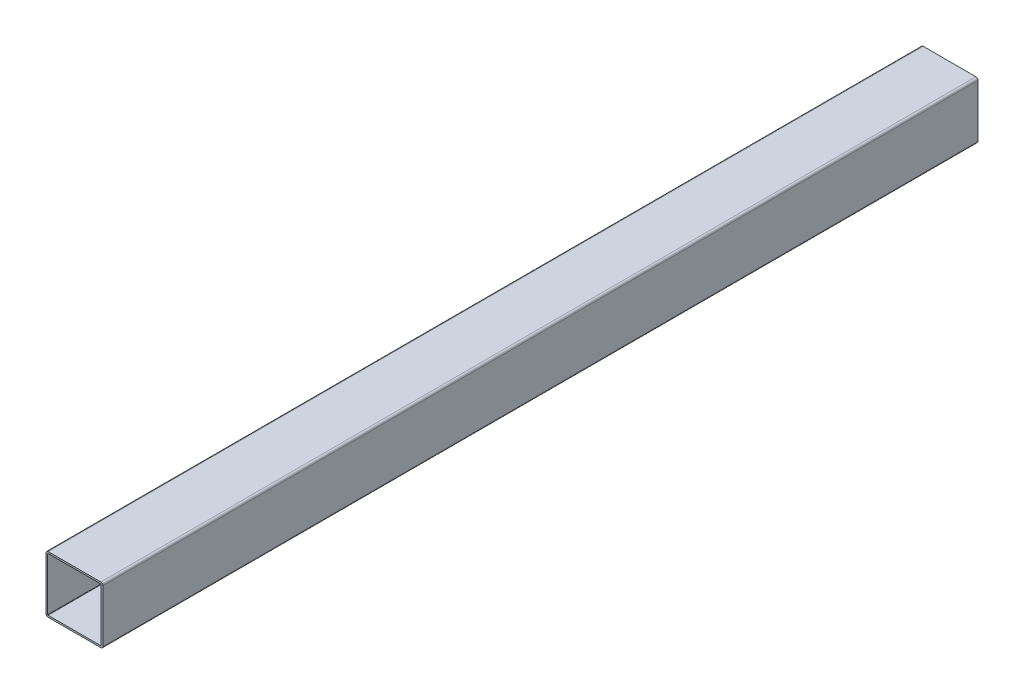
ISO-10303-21;
HEADER;
FILE_DESCRIPTION(('STEP AP214'),'2;1');
FILE_NAME('part.step','',(''),(''),'','','');
FILE_SCHEMA(('AUTOMOTIVE_DESIGN { 1 0 10303 214 1 1 1 1 }'));
ENDSEC;
DATA;
#1=APPLICATION_CONTEXT('core data for automotive mechanical design processes');
#2=APPLICATION_PROTOCOL_DEFINITION('international standard','automotive_design',2000,#1);
#3=PRODUCT_CONTEXT('',#1,'mechanical');
#4=PRODUCT('Part','Part','',(#3));
#5=PRODUCT_RELATED_PRODUCT_CATEGORY('part','',(#4));
#6=PRODUCT_DEFINITION_FORMATION('','',#4);
#7=PRODUCT_DEFINITION_CONTEXT('part definition',#1,'design');
#8=PRODUCT_DEFINITION('design','',#6,#7);
#9=PRODUCT_DEFINITION_SHAPE('','',#8);
#10=(LENGTH_UNIT() NAMED_UNIT(*) SI_UNIT(.MILLI.,.METRE.));
#11=(NAMED_UNIT(*) PLANE_ANGLE_UNIT() SI_UNIT($,.RADIAN.));
#12=(NAMED_UNIT(*) SI_UNIT($,.STERADIAN.) SOLID_ANGLE_UNIT());
#13=UNCERTAINTY_MEASURE_WITH_UNIT(LENGTH_MEASURE(1.E-05),#10,'distance_accuracy_value','');
#14=(GEOMETRIC_REPRESENTATION_CONTEXT(3) GLOBAL_UNCERTAINTY_ASSIGNED_CONTEXT((#13)) GLOBAL_UNIT_ASSIGNED_CONTEXT((#10,
#11,#12)) REPRESENTATION_CONTEXT('',''));
#15=CARTESIAN_POINT('',(0.,0.,0.));
#16=DIRECTION('',(0.,0.,1.));
#17=DIRECTION('',(1.,0.,0.));
#18=AXIS2_PLACEMENT_3D('',#15,#16,#17);
#19=CARTESIAN_POINT('',(-18.5,18.5,-615.));
#20=DIRECTION('',(0.,0.,1.));
#21=DIRECTION('',(1.,0.,0.));
#22=AXIS2_PLACEMENT_3D('',#19,#20,#21);
#23=CYLINDRICAL_SURFACE('',#22,1.5);
#24=CARTESIAN_POINT('',(-18.5,18.5,0.));
#25=DIRECTION('',(0.,0.,-1.));
#26=DIRECTION('',(-1.,0.,0.));
#27=AXIS2_PLACEMENT_3D('',#24,#25,#26);
#28=CIRCLE('',#27,1.5);
#29=CARTESIAN_POINT('',(-20.,18.5,0.));
#30=VERTEX_POINT('',#29);
#31=CARTESIAN_POINT('',(-18.5,20.,0.));
#32=VERTEX_POINT('',#31);
#33=EDGE_CURVE('E235',#30,#32,#28,.T.);
#34=ORIENTED_EDGE('',*,*,#33,.T.);
#35=DIRECTION('',(0.,0.,1.));
#36=VECTOR('',#35,1.);
#37=CARTESIAN_POINT('',(-18.5,20.,-615.));
#38=LINE('',#37,#36);
#39=CARTESIAN_POINT('',(-18.5,20.,-615.));
#40=VERTEX_POINT('',#39);
#41=EDGE_CURVE('E12',#40,#32,#38,.T.);
#42=ORIENTED_EDGE('',*,*,#41,.F.);
#43=CARTESIAN_POINT('',(-18.5,18.5,-615.));
#44=DIRECTION('',(0.,0.,-1.));
#45=DIRECTION('',(-1.,0.,0.));
#46=AXIS2_PLACEMENT_3D('',#43,#44,#45);
#47=CIRCLE('',#46,1.5);
#48=CARTESIAN_POINT('',(-20.,18.5,-615.));
#49=VERTEX_POINT('',#48);
#50=EDGE_CURVE('E313',#49,#40,#47,.T.);
#51=ORIENTED_EDGE('',*,*,#50,.F.);
#52=DIRECTION('',(0.,0.,1.));
#53=VECTOR('',#52,1.);
#54=CARTESIAN_POINT('',(-20.,18.5,-615.));
#55=LINE('',#54,#53);
#56=EDGE_CURVE('E250',#49,#30,#55,.T.);
#57=ORIENTED_EDGE('',*,*,#56,.T.);
#58=EDGE_LOOP('',(#34,#42,#51,#57));
#59=FACE_BOUND('',#58,.T.);
#60=ADVANCED_FACE('F63',(#59),#23,.T.);
#61=CARTESIAN_POINT('',(-18.5,20.,-615.));
#62=DIRECTION('',(0.,-1.,0.));
#63=DIRECTION('',(0.,0.,-1.));
#64=AXIS2_PLACEMENT_3D('',#61,#62,#63);
#65=PLANE('',#64);
#66=DIRECTION('',(1.,0.,0.));
#67=VECTOR('',#66,1.);
#68=CARTESIAN_POINT('',(-18.5,20.,0.));
#69=LINE('',#68,#67);
#70=CARTESIAN_POINT('',(18.5,20.,0.));
#71=VERTEX_POINT('',#70);
#72=EDGE_CURVE('E238',#32,#71,#69,.T.);
#73=ORIENTED_EDGE('',*,*,#72,.T.);
#74=DIRECTION('',(0.,0.,1.));
#75=VECTOR('',#74,1.);
#76=CARTESIAN_POINT('',(18.5,20.,-615.));
#77=LINE('',#76,#75);
#78=CARTESIAN_POINT('',(18.5,20.,-615.));
#79=VERTEX_POINT('',#78);
#80=EDGE_CURVE('E73',#79,#71,#77,.T.);
#81=ORIENTED_EDGE('',*,*,#80,.F.);
#82=DIRECTION('',(1.,0.,0.));
#83=VECTOR('',#82,1.);
#84=CARTESIAN_POINT('',(-18.5,20.,-615.));
#85=LINE('',#84,#83);
#86=EDGE_CURVE('E315',#40,#79,#85,.T.);
#87=ORIENTED_EDGE('',*,*,#86,.F.);
#88=ORIENTED_EDGE('',*,*,#41,.T.);
#89=EDGE_LOOP('',(#73,#81,#87,#88));
#90=FACE_BOUND('',#89,.T.);
#91=ADVANCED_FACE('F350',(#90),#65,.F.);
#92=CARTESIAN_POINT('',(18.5,18.5,-615.));
#93=DIRECTION('',(0.,0.,1.));
#94=DIRECTION('',(1.,0.,0.));
#95=AXIS2_PLACEMENT_3D('',#92,#93,#94);
#96=CYLINDRICAL_SURFACE('',#95,1.5);
#97=CARTESIAN_POINT('',(18.5,18.5,0.));
#98=DIRECTION('',(0.,0.,-1.));
#99=DIRECTION('',(-1.,0.,0.));
#100=AXIS2_PLACEMENT_3D('',#97,#98,#99);
#101=CIRCLE('',#100,1.5);
#102=CARTESIAN_POINT('',(20.,18.5,0.));
#103=VERTEX_POINT('',#102);
#104=EDGE_CURVE('E240',#71,#103,#101,.T.);
#105=ORIENTED_EDGE('',*,*,#104,.T.);
#106=DIRECTION('',(0.,0.,1.));
#107=VECTOR('',#106,1.);
#108=CARTESIAN_POINT('',(20.,18.5,-615.));
#109=LINE('',#108,#107);
#110=CARTESIAN_POINT('',(20.,18.5,-615.));
#111=VERTEX_POINT('',#110);
#112=EDGE_CURVE('E257',#111,#103,#109,.T.);
#113=ORIENTED_EDGE('',*,*,#112,.F.);
#114=CARTESIAN_POINT('',(18.5,18.5,-615.));
#115=DIRECTION('',(0.,0.,-1.));
#116=DIRECTION('',(-1.,0.,0.));
#117=AXIS2_PLACEMENT_3D('',#114,#115,#116);
#118=CIRCLE('',#117,1.5);
#119=EDGE_CURVE('E317',#79,#111,#118,.T.);
#120=ORIENTED_EDGE('',*,*,#119,.F.);
#121=ORIENTED_EDGE('',*,*,#80,.T.);
#122=EDGE_LOOP('',(#105,#113,#120,#121));
#123=FACE_BOUND('',#122,.T.);
#124=ADVANCED_FACE('F355',(#123),#96,.T.);
#125=CARTESIAN_POINT('',(20.,-18.5,-615.));
#126=DIRECTION('',(-1.,0.,0.));
#127=DIRECTION('',(0.,0.,1.));
#128=AXIS2_PLACEMENT_3D('',#125,#126,#127);
#129=PLANE('',#128);
#130=DIRECTION('',(0.,-1.,0.));
#131=VECTOR('',#130,1.);
#132=CARTESIAN_POINT('',(20.,-18.5,0.));
#133=LINE('',#132,#131);
#134=CARTESIAN_POINT('',(20.,-18.5,0.));
#135=VERTEX_POINT('',#134);
#136=EDGE_CURVE('E242',#103,#135,#133,.T.);
#137=ORIENTED_EDGE('',*,*,#136,.T.);
#138=DIRECTION('',(0.,0.,1.));
#139=VECTOR('',#138,1.);
#140=CARTESIAN_POINT('',(20.,-18.5,-615.));
#141=LINE('',#140,#139);
#142=CARTESIAN_POINT('',(20.,-18.5,-615.));
#143=VERTEX_POINT('',#142);
#144=EDGE_CURVE('E254',#143,#135,#141,.T.);
#145=ORIENTED_EDGE('',*,*,#144,.F.);
#146=DIRECTION('',(0.,-1.,0.));
#147=VECTOR('',#146,1.);
#148=CARTESIAN_POINT('',(20.,-18.5,-615.));
#149=LINE('',#148,#147);
#150=EDGE_CURVE('E319',#111,#143,#149,.T.);
#151=ORIENTED_EDGE('',*,*,#150,.F.);
#152=ORIENTED_EDGE('',*,*,#112,.T.);
#153=EDGE_LOOP('',(#137,#145,#151,#152));
#154=FACE_BOUND('',#153,.T.);
#155=ADVANCED_FACE('F325',(#154),#129,.F.);
#156=CARTESIAN_POINT('',(18.5,-18.5,-615.));
#157=DIRECTION('',(0.,0.,1.));
#158=DIRECTION('',(1.,0.,0.));
#159=AXIS2_PLACEMENT_3D('',#156,#157,#158);
#160=CYLINDRICAL_SURFACE('',#159,1.5);
#161=CARTESIAN_POINT('',(18.5,-18.5,0.));
#162=DIRECTION('',(0.,0.,-1.));
#163=DIRECTION('',(-1.,0.,0.));
#164=AXIS2_PLACEMENT_3D('',#161,#162,#163);
#165=CIRCLE('',#164,1.5);
#166=CARTESIAN_POINT('',(18.5,-20.,0.));
#167=VERTEX_POINT('',#166);
#168=EDGE_CURVE('E244',#135,#167,#165,.T.);
#169=ORIENTED_EDGE('',*,*,#168,.T.);
#170=DIRECTION('',(0.,0.,1.));
#171=VECTOR('',#170,1.);
#172=CARTESIAN_POINT('',(18.5,-20.,-615.));
#173=LINE('',#172,#171);
#174=CARTESIAN_POINT('',(18.5,-20.,-615.));
#175=VERTEX_POINT('',#174);
#176=EDGE_CURVE('E202',#175,#167,#173,.T.);
#177=ORIENTED_EDGE('',*,*,#176,.F.);
#178=CARTESIAN_POINT('',(18.5,-18.5,-615.));
#179=DIRECTION('',(0.,0.,-1.));
#180=DIRECTION('',(-1.,0.,0.));
#181=AXIS2_PLACEMENT_3D('',#178,#179,#180);
#182=CIRCLE('',#181,1.5);
#183=EDGE_CURVE('E193',#143,#175,#182,.T.);
#184=ORIENTED_EDGE('',*,*,#183,.F.);
#185=ORIENTED_EDGE('',*,*,#144,.T.);
#186=EDGE_LOOP('',(#169,#177,#184,#185));
#187=FACE_BOUND('',#186,.T.);
#188=ADVANCED_FACE('F329',(#187),#160,.T.);
#189=CARTESIAN_POINT('',(18.5,-20.,-615.));
#190=DIRECTION('',(0.,1.,0.));
#191=DIRECTION('',(0.,0.,1.));
#192=AXIS2_PLACEMENT_3D('',#189,#190,#191);
#193=PLANE('',#192);
#194=DIRECTION('',(-1.,0.,0.));
#195=VECTOR('',#194,1.);
#196=CARTESIAN_POINT('',(18.5,-20.,0.));
#197=LINE('',#196,#195);
#198=CARTESIAN_POINT('',(-18.5,-20.,0.));
#199=VERTEX_POINT('',#198);
#200=EDGE_CURVE('E201',#167,#199,#197,.T.);
#201=ORIENTED_EDGE('',*,*,#200,.T.);
#202=DIRECTION('',(0.,0.,1.));
#203=VECTOR('',#202,1.);
#204=CARTESIAN_POINT('',(-18.5,-20.,-615.));
#205=LINE('',#204,#203);
#206=CARTESIAN_POINT('',(-18.5,-20.,-615.));
#207=VERTEX_POINT('',#206);
#208=EDGE_CURVE('E198',#207,#199,#205,.T.);
#209=ORIENTED_EDGE('',*,*,#208,.F.);
#210=DIRECTION('',(-1.,0.,0.));
#211=VECTOR('',#210,1.);
#212=CARTESIAN_POINT('',(18.5,-20.,-615.));
#213=LINE('',#212,#211);
#214=EDGE_CURVE('E187',#175,#207,#213,.T.);
#215=ORIENTED_EDGE('',*,*,#214,.F.);
#216=ORIENTED_EDGE('',*,*,#176,.T.);
#217=EDGE_LOOP('',(#201,#209,#215,#216));
#218=FACE_BOUND('',#217,.T.);
#219=ADVANCED_FACE('F199',(#218),#193,.F.);
#220=CARTESIAN_POINT('',(-18.5,-18.5,-615.));
#221=DIRECTION('',(0.,0.,1.));
#222=DIRECTION('',(1.,0.,0.));
#223=AXIS2_PLACEMENT_3D('',#220,#221,#222);
#224=CYLINDRICAL_SURFACE('',#223,1.5);
#225=CARTESIAN_POINT('',(-18.5,-18.5,0.));
#226=DIRECTION('',(0.,0.,-1.));
#227=DIRECTION('',(-1.,0.,0.));
#228=AXIS2_PLACEMENT_3D('',#225,#226,#227);
#229=CIRCLE('',#228,1.5);
#230=CARTESIAN_POINT('',(-20.,-18.5,0.));
#231=VERTEX_POINT('',#230);
#232=EDGE_CURVE('E135',#199,#231,#229,.T.);
#233=ORIENTED_EDGE('',*,*,#232,.T.);
#234=DIRECTION('',(0.,0.,1.));
#235=VECTOR('',#234,1.);
#236=CARTESIAN_POINT('',(-20.,-18.5,-615.));
#237=LINE('',#236,#235);
#238=CARTESIAN_POINT('',(-20.,-18.5,-615.));
#239=VERTEX_POINT('',#238);
#240=EDGE_CURVE('E203',#239,#231,#237,.T.);
#241=ORIENTED_EDGE('',*,*,#240,.F.);
#242=CARTESIAN_POINT('',(-18.5,-18.5,-615.));
#243=DIRECTION('',(0.,0.,-1.));
#244=DIRECTION('',(-1.,0.,0.));
#245=AXIS2_PLACEMENT_3D('',#242,#243,#244);
#246=CIRCLE('',#245,1.5);
#247=EDGE_CURVE('E191',#207,#239,#246,.T.);
#248=ORIENTED_EDGE('',*,*,#247,.F.);
#249=ORIENTED_EDGE('',*,*,#208,.T.);
#250=EDGE_LOOP('',(#233,#241,#248,#249));
#251=FACE_BOUND('',#250,.T.);
#252=ADVANCED_FACE('F205',(#251),#224,.T.);
#253=CARTESIAN_POINT('',(18.5,18.5,-615.));
#254=DIRECTION('',(0.,0.,1.));
#255=DIRECTION('',(1.,0.,0.));
#256=AXIS2_PLACEMENT_3D('',#253,#254,#255);
#257=CYLINDRICAL_SURFACE('',#256,0.3);
#258=CARTESIAN_POINT('',(18.5,18.5,0.));
#259=DIRECTION('',(0.,0.,-1.));
#260=DIRECTION('',(-1.,0.,0.));
#261=AXIS2_PLACEMENT_3D('',#258,#259,#260);
#262=CIRCLE('',#261,0.3);
#263=CARTESIAN_POINT('',(18.5,18.8,0.));
#264=VERTEX_POINT('',#263);
#265=CARTESIAN_POINT('',(18.8,18.5,0.));
#266=VERTEX_POINT('',#265);
#267=EDGE_CURVE('E211',#264,#266,#262,.T.);
#268=ORIENTED_EDGE('',*,*,#267,.F.);
#269=DIRECTION('',(0.,0.,1.));
#270=VECTOR('',#269,1.);
#271=CARTESIAN_POINT('',(18.5,18.8,-615.));
#272=LINE('',#271,#270);
#273=CARTESIAN_POINT('',(18.5,18.8,-615.));
#274=VERTEX_POINT('',#273);
#275=EDGE_CURVE('E67',#274,#264,#272,.T.);
#276=ORIENTED_EDGE('',*,*,#275,.F.);
#277=CARTESIAN_POINT('',(18.5,18.5,-615.));
#278=DIRECTION('',(0.,0.,-1.));
#279=DIRECTION('',(-1.,0.,0.));
#280=AXIS2_PLACEMENT_3D('',#277,#278,#279);
#281=CIRCLE('',#280,0.3);
#282=CARTESIAN_POINT('',(18.8,18.5,-615.));
#283=VERTEX_POINT('',#282);
#284=EDGE_CURVE('E249',#274,#283,#281,.T.);
#285=ORIENTED_EDGE('',*,*,#284,.T.);
#286=DIRECTION('',(0.,0.,1.));
#287=VECTOR('',#286,1.);
#288=CARTESIAN_POINT('',(18.8,18.5,-615.));
#289=LINE('',#288,#287);
#290=EDGE_CURVE('E207',#283,#266,#289,.T.);
#291=ORIENTED_EDGE('',*,*,#290,.T.);
#292=EDGE_LOOP('',(#268,#276,#285,#291));
#293=FACE_BOUND('',#292,.T.);
#294=ADVANCED_FACE('F65',(#293),#257,.F.);
#295=CARTESIAN_POINT('',(-18.5,18.8,-615.));
#296=DIRECTION('',(0.,-1.,0.));
#297=DIRECTION('',(0.,0.,-1.));
#298=AXIS2_PLACEMENT_3D('',#295,#296,#297);
#299=PLANE('',#298);
#300=DIRECTION('',(1.,0.,0.));
#301=VECTOR('',#300,1.);
#302=CARTESIAN_POINT('',(-18.5,18.8,0.));
#303=LINE('',#302,#301);
#304=CARTESIAN_POINT('',(-18.5,18.8,0.));
#305=VERTEX_POINT('',#304);
#306=EDGE_CURVE('E214',#305,#264,#303,.T.);
#307=ORIENTED_EDGE('',*,*,#306,.F.);
#308=DIRECTION('',(0.,0.,1.));
#309=VECTOR('',#308,1.);
#310=CARTESIAN_POINT('',(-18.5,18.8,-615.));
#311=LINE('',#310,#309);
#312=CARTESIAN_POINT('',(-18.5,18.8,-615.));
#313=VERTEX_POINT('',#312);
#314=EDGE_CURVE('E272',#313,#305,#311,.T.);
#315=ORIENTED_EDGE('',*,*,#314,.F.);
#316=DIRECTION('',(1.,0.,0.));
#317=VECTOR('',#316,1.);
#318=CARTESIAN_POINT('',(-18.5,18.8,-615.));
#319=LINE('',#318,#317);
#320=EDGE_CURVE('E281',#313,#274,#319,.T.);
#321=ORIENTED_EDGE('',*,*,#320,.T.);
#322=ORIENTED_EDGE('',*,*,#275,.T.);
#323=EDGE_LOOP('',(#307,#315,#321,#322));
#324=FACE_BOUND('',#323,.T.);
#325=ADVANCED_FACE('F279',(#324),#299,.T.);
#326=CARTESIAN_POINT('',(-18.5,18.5,-615.));
#327=DIRECTION('',(0.,0.,1.));
#328=DIRECTION('',(1.,0.,0.));
#329=AXIS2_PLACEMENT_3D('',#326,#327,#328);
#330=CYLINDRICAL_SURFACE('',#329,0.3);
#331=CARTESIAN_POINT('',(-18.5,18.5,0.));
#332=DIRECTION('',(0.,0.,-1.));
#333=DIRECTION('',(-1.,0.,0.));
#334=AXIS2_PLACEMENT_3D('',#331,#332,#333);
#335=CIRCLE('',#334,0.3);
#336=CARTESIAN_POINT('',(-18.8,18.5,0.));
#337=VERTEX_POINT('',#336);
#338=EDGE_CURVE('E217',#337,#305,#335,.T.);
#339=ORIENTED_EDGE('',*,*,#338,.F.);
#340=DIRECTION('',(0.,0.,1.));
#341=VECTOR('',#340,1.);
#342=CARTESIAN_POINT('',(-18.8,18.5,-615.));
#343=LINE('',#342,#341);
#344=CARTESIAN_POINT('',(-18.8,18.5,-615.));
#345=VERTEX_POINT('',#344);
#346=EDGE_CURVE('E271',#345,#337,#343,.T.);
#347=ORIENTED_EDGE('',*,*,#346,.F.);
#348=CARTESIAN_POINT('',(-18.5,18.5,-615.));
#349=DIRECTION('',(0.,0.,-1.));
#350=DIRECTION('',(-1.,0.,0.));
#351=AXIS2_PLACEMENT_3D('',#348,#349,#350);
#352=CIRCLE('',#351,0.3);
#353=EDGE_CURVE('E289',#345,#313,#352,.T.);
#354=ORIENTED_EDGE('',*,*,#353,.T.);
#355=ORIENTED_EDGE('',*,*,#314,.T.);
#356=EDGE_LOOP('',(#339,#347,#354,#355));
#357=FACE_BOUND('',#356,.T.);
#358=ADVANCED_FACE('F287',(#357),#330,.F.);
#359=CARTESIAN_POINT('',(-18.8,18.5,-615.));
#360=DIRECTION('',(1.,0.,0.));
#361=DIRECTION('',(0.,0.,-1.));
#362=AXIS2_PLACEMENT_3D('',#359,#360,#361);
#363=PLANE('',#362);
#364=DIRECTION('',(0.,1.,0.));
#365=VECTOR('',#364,1.);
#366=CARTESIAN_POINT('',(-18.8,18.5,0.));
#367=LINE('',#366,#365);
#368=CARTESIAN_POINT('',(-18.8,-18.5,0.));
#369=VERTEX_POINT('',#368);
#370=EDGE_CURVE('E220',#369,#337,#367,.T.);
#371=ORIENTED_EDGE('',*,*,#370,.F.);
#372=DIRECTION('',(0.,0.,1.));
#373=VECTOR('',#372,1.);
#374=CARTESIAN_POINT('',(-18.8,-18.5,-615.));
#375=LINE('',#374,#373);
#376=CARTESIAN_POINT('',(-18.8,-18.5,-615.));
#377=VERTEX_POINT('',#376);
#378=EDGE_CURVE('E269',#377,#369,#375,.T.);
#379=ORIENTED_EDGE('',*,*,#378,.F.);
#380=DIRECTION('',(0.,1.,0.));
#381=VECTOR('',#380,1.);
#382=CARTESIAN_POINT('',(-18.8,18.5,-615.));
#383=LINE('',#382,#381);
#384=EDGE_CURVE('E295',#377,#345,#383,.T.);
#385=ORIENTED_EDGE('',*,*,#384,.T.);
#386=ORIENTED_EDGE('',*,*,#346,.T.);
#387=EDGE_LOOP('',(#371,#379,#385,#386));
#388=FACE_BOUND('',#387,.T.);
#389=ADVANCED_FACE('F298',(#388),#363,.T.);
#390=CARTESIAN_POINT('',(-18.5,-18.5,-615.));
#391=DIRECTION('',(0.,0.,1.));
#392=DIRECTION('',(1.,0.,0.));
#393=AXIS2_PLACEMENT_3D('',#390,#391,#392);
#394=CYLINDRICAL_SURFACE('',#393,0.300000000000005);
#395=CARTESIAN_POINT('',(-18.5,-18.5,0.));
#396=DIRECTION('',(0.,0.,-1.));
#397=DIRECTION('',(-1.,0.,0.));
#398=AXIS2_PLACEMENT_3D('',#395,#396,#397);
#399=CIRCLE('',#398,0.300000000000005);
#400=CARTESIAN_POINT('',(-18.5,-18.8,0.));
#401=VERTEX_POINT('',#400);
#402=EDGE_CURVE('E223',#401,#369,#399,.T.);
#403=ORIENTED_EDGE('',*,*,#402,.F.);
#404=DIRECTION('',(0.,0.,1.));
#405=VECTOR('',#404,1.);
#406=CARTESIAN_POINT('',(-18.5,-18.8,-615.));
#407=LINE('',#406,#405);
#408=CARTESIAN_POINT('',(-18.5,-18.8,-615.));
#409=VERTEX_POINT('',#408);
#410=EDGE_CURVE('E267',#409,#401,#407,.T.);
#411=ORIENTED_EDGE('',*,*,#410,.F.);
#412=CARTESIAN_POINT('',(-18.5,-18.5,-615.));
#413=DIRECTION('',(0.,0.,-1.));
#414=DIRECTION('',(-1.,0.,0.));
#415=AXIS2_PLACEMENT_3D('',#412,#413,#414);
#416=CIRCLE('',#415,0.300000000000005);
#417=EDGE_CURVE('E299',#409,#377,#416,.T.);
#418=ORIENTED_EDGE('',*,*,#417,.T.);
#419=ORIENTED_EDGE('',*,*,#378,.T.);
#420=EDGE_LOOP('',(#403,#411,#418,#419));
#421=FACE_BOUND('',#420,.T.);
#422=ADVANCED_FACE('F366',(#421),#394,.F.);
#423=CARTESIAN_POINT('',(18.5,-18.8,-615.));
#424=DIRECTION('',(0.,1.,0.));
#425=DIRECTION('',(0.,0.,1.));
#426=AXIS2_PLACEMENT_3D('',#423,#424,#425);
#427=PLANE('',#426);
#428=DIRECTION('',(-1.,0.,0.));
#429=VECTOR('',#428,1.);
#430=CARTESIAN_POINT('',(18.5,-18.8,0.));
#431=LINE('',#430,#429);
#432=CARTESIAN_POINT('',(18.5,-18.8,0.));
#433=VERTEX_POINT('',#432);
#434=EDGE_CURVE('E226',#433,#401,#431,.T.);
#435=ORIENTED_EDGE('',*,*,#434,.F.);
#436=DIRECTION('',(0.,0.,1.));
#437=VECTOR('',#436,1.);
#438=CARTESIAN_POINT('',(18.5,-18.8,-615.));
#439=LINE('',#438,#437);
#440=CARTESIAN_POINT('',(18.5,-18.8,-615.));
#441=VERTEX_POINT('',#440);
#442=EDGE_CURVE('E265',#441,#433,#439,.T.);
#443=ORIENTED_EDGE('',*,*,#442,.F.);
#444=DIRECTION('',(-1.,0.,0.));
#445=VECTOR('',#444,1.);
#446=CARTESIAN_POINT('',(18.5,-18.8,-615.));
#447=LINE('',#446,#445);
#448=EDGE_CURVE('E301',#441,#409,#447,.T.);
#449=ORIENTED_EDGE('',*,*,#448,.T.);
#450=ORIENTED_EDGE('',*,*,#410,.T.);
#451=EDGE_LOOP('',(#435,#443,#449,#450));
#452=FACE_BOUND('',#451,.T.);
#453=ADVANCED_FACE('F362',(#452),#427,.T.);
#454=CARTESIAN_POINT('',(18.5,-18.5,-615.));
#455=DIRECTION('',(0.,0.,1.));
#456=DIRECTION('',(1.,0.,0.));
#457=AXIS2_PLACEMENT_3D('',#454,#455,#456);
#458=CYLINDRICAL_SURFACE('',#457,0.300000000000003);
#459=CARTESIAN_POINT('',(18.5,-18.5,0.));
#460=DIRECTION('',(0.,0.,-1.));
#461=DIRECTION('',(-1.,0.,0.));
#462=AXIS2_PLACEMENT_3D('',#459,#460,#461);
#463=CIRCLE('',#462,0.300000000000003);
#464=CARTESIAN_POINT('',(18.8,-18.5,0.));
#465=VERTEX_POINT('',#464);
#466=EDGE_CURVE('E229',#465,#433,#463,.T.);
#467=ORIENTED_EDGE('',*,*,#466,.F.);
#468=DIRECTION('',(0.,0.,1.));
#469=VECTOR('',#468,1.);
#470=CARTESIAN_POINT('',(18.8,-18.5,-615.));
#471=LINE('',#470,#469);
#472=CARTESIAN_POINT('',(18.8,-18.5,-615.));
#473=VERTEX_POINT('',#472);
#474=EDGE_CURVE('E263',#473,#465,#471,.T.);
#475=ORIENTED_EDGE('',*,*,#474,.F.);
#476=CARTESIAN_POINT('',(18.5,-18.5,-615.));
#477=DIRECTION('',(0.,0.,-1.));
#478=DIRECTION('',(-1.,0.,0.));
#479=AXIS2_PLACEMENT_3D('',#476,#477,#478);
#480=CIRCLE('',#479,0.300000000000003);
#481=EDGE_CURVE('E307',#473,#441,#480,.T.);
#482=ORIENTED_EDGE('',*,*,#481,.T.);
#483=ORIENTED_EDGE('',*,*,#442,.T.);
#484=EDGE_LOOP('',(#467,#475,#482,#483));
#485=FACE_BOUND('',#484,.T.);
#486=ADVANCED_FACE('F344',(#485),#458,.F.);
#487=CARTESIAN_POINT('',(18.8,-18.5,-615.));
#488=DIRECTION('',(-1.,0.,0.));
#489=DIRECTION('',(0.,0.,1.));
#490=AXIS2_PLACEMENT_3D('',#487,#488,#489);
#491=PLANE('',#490);
#492=DIRECTION('',(0.,-1.,0.));
#493=VECTOR('',#492,1.);
#494=CARTESIAN_POINT('',(18.8,-18.5,0.));
#495=LINE('',#494,#493);
#496=EDGE_CURVE('E232',#266,#465,#495,.T.);
#497=ORIENTED_EDGE('',*,*,#496,.F.);
#498=ORIENTED_EDGE('',*,*,#290,.F.);
#499=DIRECTION('',(0.,-1.,0.));
#500=VECTOR('',#499,1.);
#501=CARTESIAN_POINT('',(18.8,-18.5,-615.));
#502=LINE('',#501,#500);
#503=EDGE_CURVE('E310',#283,#473,#502,.T.);
#504=ORIENTED_EDGE('',*,*,#503,.T.);
#505=ORIENTED_EDGE('',*,*,#474,.T.);
#506=EDGE_LOOP('',(#497,#498,#504,#505));
#507=FACE_BOUND('',#506,.T.);
#508=ADVANCED_FACE('F337',(#507),#491,.T.);
#509=CARTESIAN_POINT('',(-20.,18.5,-615.));
#510=DIRECTION('',(1.,0.,0.));
#511=DIRECTION('',(0.,0.,-1.));
#512=AXIS2_PLACEMENT_3D('',#509,#510,#511);
#513=PLANE('',#512);
#514=DIRECTION('',(0.,1.,0.));
#515=VECTOR('',#514,1.);
#516=CARTESIAN_POINT('',(-20.,18.5,0.));
#517=LINE('',#516,#515);
#518=EDGE_CURVE('E141',#231,#30,#517,.T.);
#519=ORIENTED_EDGE('',*,*,#518,.T.);
#520=ORIENTED_EDGE('',*,*,#56,.F.);
#521=DIRECTION('',(0.,1.,0.));
#522=VECTOR('',#521,1.);
#523=CARTESIAN_POINT('',(-20.,18.5,-615.));
#524=LINE('',#523,#522);
#525=EDGE_CURVE('E82',#239,#49,#524,.T.);
#526=ORIENTED_EDGE('',*,*,#525,.F.);
#527=ORIENTED_EDGE('',*,*,#240,.T.);
#528=EDGE_LOOP('',(#519,#520,#526,#527));
#529=FACE_BOUND('',#528,.T.);
#530=ADVANCED_FACE('F335',(#529),#513,.F.);
#531=CARTESIAN_POINT('',(-18.5,18.5,-615.));
#532=DIRECTION('',(0.,0.,-1.));
#533=DIRECTION('',(-1.,0.,0.));
#534=AXIS2_PLACEMENT_3D('',#531,#532,#533);
#535=PLANE('',#534);
#536=ORIENTED_EDGE('',*,*,#284,.F.);
#537=ORIENTED_EDGE('',*,*,#320,.F.);
#538=ORIENTED_EDGE('',*,*,#353,.F.);
#539=ORIENTED_EDGE('',*,*,#384,.F.);
#540=ORIENTED_EDGE('',*,*,#417,.F.);
#541=ORIENTED_EDGE('',*,*,#448,.F.);
#542=ORIENTED_EDGE('',*,*,#481,.F.);
#543=ORIENTED_EDGE('',*,*,#503,.F.);
#544=EDGE_LOOP('',(#536,#537,#538,#539,#540,#541,#542,#543));
#545=FACE_BOUND('',#544,.T.);
#546=ORIENTED_EDGE('',*,*,#50,.T.);
#547=ORIENTED_EDGE('',*,*,#86,.T.);
#548=ORIENTED_EDGE('',*,*,#119,.T.);
#549=ORIENTED_EDGE('',*,*,#150,.T.);
#550=ORIENTED_EDGE('',*,*,#183,.T.);
#551=ORIENTED_EDGE('',*,*,#214,.T.);
#552=ORIENTED_EDGE('',*,*,#247,.T.);
#553=ORIENTED_EDGE('',*,*,#525,.T.);
#554=EDGE_LOOP('',(#546,#547,#548,#549,#550,#551,#552,#553));
#555=FACE_BOUND('',#554,.T.);
#556=ADVANCED_FACE('F189',(#545,#555),#535,.T.);
#557=CARTESIAN_POINT('',(-18.5,18.5,0.));
#558=DIRECTION('',(0.,0.,-1.));
#559=DIRECTION('',(-1.,0.,0.));
#560=AXIS2_PLACEMENT_3D('',#557,#558,#559);
#561=PLANE('',#560);
#562=ORIENTED_EDGE('',*,*,#267,.T.);
#563=ORIENTED_EDGE('',*,*,#496,.T.);
#564=ORIENTED_EDGE('',*,*,#466,.T.);
#565=ORIENTED_EDGE('',*,*,#434,.T.);
#566=ORIENTED_EDGE('',*,*,#402,.T.);
#567=ORIENTED_EDGE('',*,*,#370,.T.);
#568=ORIENTED_EDGE('',*,*,#338,.T.);
#569=ORIENTED_EDGE('',*,*,#306,.T.);
#570=EDGE_LOOP('',(#562,#563,#564,#565,#566,#567,#568,#569));
#571=FACE_BOUND('',#570,.T.);
#572=ORIENTED_EDGE('',*,*,#33,.F.);
#573=ORIENTED_EDGE('',*,*,#518,.F.);
#574=ORIENTED_EDGE('',*,*,#232,.F.);
#575=ORIENTED_EDGE('',*,*,#200,.F.);
#576=ORIENTED_EDGE('',*,*,#168,.F.);
#577=ORIENTED_EDGE('',*,*,#136,.F.);
#578=ORIENTED_EDGE('',*,*,#104,.F.);
#579=ORIENTED_EDGE('',*,*,#72,.F.);
#580=EDGE_LOOP('',(#572,#573,#574,#575,#576,#577,#578,#579));
#581=FACE_BOUND('',#580,.T.);
#582=ADVANCED_FACE('F284',(#571,#581),#561,.F.);
#583=CLOSED_SHELL('',(#60,#91,#124,#155,#188,#219,#252,#294,#325,#358,#389,#422,#453,#486,#508,
#530,#556,#582));
#584=MANIFOLD_SOLID_BREP('B2',#583);
#585=ADVANCED_BREP_SHAPE_REPRESENTATION('',(#18,#584),#14);
#586=SHAPE_DEFINITION_REPRESENTATION(#9,#585);
ENDSEC;
END-ISO-10303-21;
